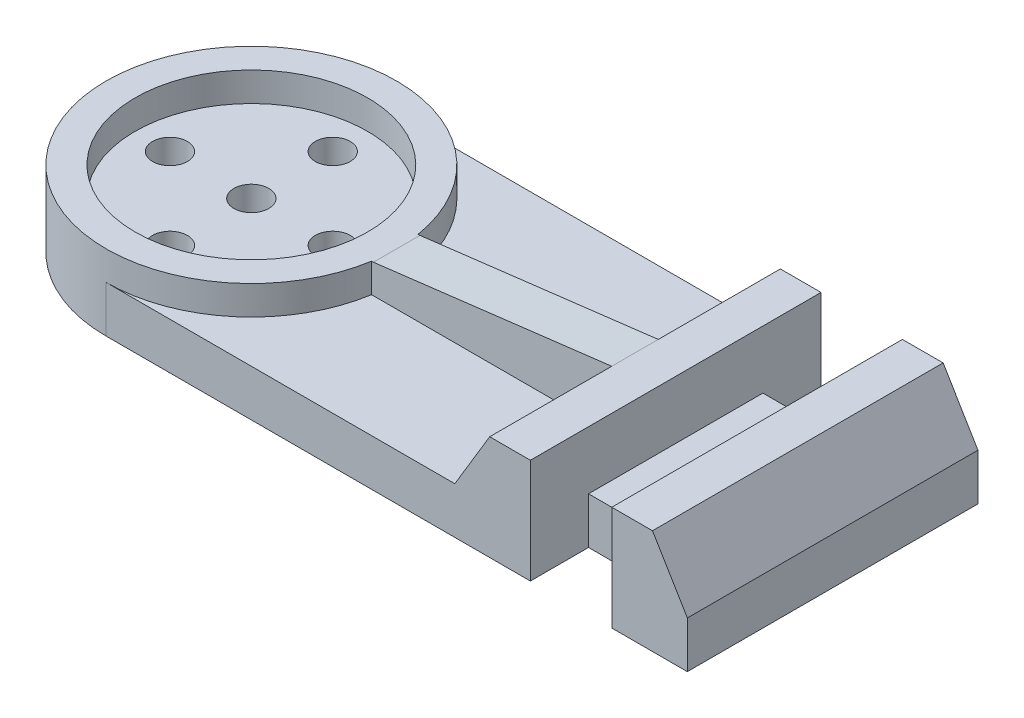
ISO-10303-21;
HEADER;
FILE_DESCRIPTION(('STEP AP214'),'2;1');
FILE_NAME('part.step','',(''),(''),'','','');
FILE_SCHEMA(('AUTOMOTIVE_DESIGN { 1 0 10303 214 1 1 1 1 }'));
ENDSEC;
DATA;
#1=APPLICATION_CONTEXT('core data for automotive mechanical design processes');
#2=APPLICATION_PROTOCOL_DEFINITION('international standard','automotive_design',2000,#1);
#3=PRODUCT_CONTEXT('',#1,'mechanical');
#4=PRODUCT('Part','Part','',(#3));
#5=PRODUCT_RELATED_PRODUCT_CATEGORY('part','',(#4));
#6=PRODUCT_DEFINITION_FORMATION('','',#4);
#7=PRODUCT_DEFINITION_CONTEXT('part definition',#1,'design');
#8=PRODUCT_DEFINITION('design','',#6,#7);
#9=PRODUCT_DEFINITION_SHAPE('','',#8);
#10=(LENGTH_UNIT() NAMED_UNIT(*) SI_UNIT(.MILLI.,.METRE.));
#11=(NAMED_UNIT(*) PLANE_ANGLE_UNIT() SI_UNIT($,.RADIAN.));
#12=(NAMED_UNIT(*) SI_UNIT($,.STERADIAN.) SOLID_ANGLE_UNIT());
#13=UNCERTAINTY_MEASURE_WITH_UNIT(LENGTH_MEASURE(1.E-05),#10,'distance_accuracy_value','');
#14=(GEOMETRIC_REPRESENTATION_CONTEXT(3) GLOBAL_UNCERTAINTY_ASSIGNED_CONTEXT((#13)) GLOBAL_UNIT_ASSIGNED_CONTEXT((#10,
#11,#12)) REPRESENTATION_CONTEXT('',''));
#15=CARTESIAN_POINT('',(0.,0.,0.));
#16=DIRECTION('',(0.,0.,1.));
#17=DIRECTION('',(1.,0.,0.));
#18=AXIS2_PLACEMENT_3D('',#15,#16,#17);
#19=CARTESIAN_POINT('',(0.,4.,0.));
#20=DIRECTION('',(0.,1.,0.));
#21=DIRECTION('',(0.,0.,1.));
#22=AXIS2_PLACEMENT_3D('',#19,#20,#21);
#23=PLANE('',#22);
#24=CARTESIAN_POINT('',(0.,4.,0.));
#25=DIRECTION('',(0.,1.,0.));
#26=DIRECTION('',(0.,0.,1.));
#27=AXIS2_PLACEMENT_3D('',#24,#25,#26);
#28=CIRCLE('',#27,12.5);
#29=CARTESIAN_POINT('',(12.3389626792531,4.,-2.));
#30=VERTEX_POINT('',#29);
#31=CARTESIAN_POINT('',(0.,4.,-12.5));
#32=VERTEX_POINT('',#31);
#33=EDGE_CURVE('E249',#30,#32,#28,.T.);
#34=ORIENTED_EDGE('',*,*,#33,.F.);
#35=DIRECTION('',(1.,0.,0.));
#36=VECTOR('',#35,1.);
#37=CARTESIAN_POINT('',(30.,4.,-2.));
#38=LINE('',#37,#36);
#39=CARTESIAN_POINT('',(30.,4.,-2.));
#40=VERTEX_POINT('',#39);
#41=EDGE_CURVE('E401',#30,#40,#38,.T.);
#42=ORIENTED_EDGE('',*,*,#41,.T.);
#43=DIRECTION('',(0.,0.,1.));
#44=VECTOR('',#43,1.);
#45=CARTESIAN_POINT('',(30.,4.,-33.1155281280883));
#46=LINE('',#45,#44);
#47=CARTESIAN_POINT('',(30.,4.,-12.5));
#48=VERTEX_POINT('',#47);
#49=EDGE_CURVE('E206',#48,#40,#46,.T.);
#50=ORIENTED_EDGE('',*,*,#49,.F.);
#51=DIRECTION('',(1.,0.,0.));
#52=VECTOR('',#51,1.);
#53=CARTESIAN_POINT('',(0.,4.,-12.5));
#54=LINE('',#53,#52);
#55=EDGE_CURVE('E264',#32,#48,#54,.T.);
#56=ORIENTED_EDGE('',*,*,#55,.F.);
#57=EDGE_LOOP('',(#34,#42,#50,#56));
#58=FACE_BOUND('',#57,.T.);
#59=ADVANCED_FACE('F39',(#58),#23,.T.);
#60=CARTESIAN_POINT('',(30.,4.,-33.1155281280883));
#61=DIRECTION('',(-0.857492925712544,0.514495755427526,0.));
#62=DIRECTION('',(-0.514495755427526,-0.857492925712544,0.));
#63=AXIS2_PLACEMENT_3D('',#60,#61,#62);
#64=PLANE('',#63);
#65=ORIENTED_EDGE('',*,*,#49,.T.);
#66=DIRECTION('',(0.514495755427526,0.857492925712544,0.));
#67=VECTOR('',#66,1.);
#68=CARTESIAN_POINT('',(30.,4.,-2.));
#69=LINE('',#68,#67);
#70=CARTESIAN_POINT('',(33.,9.,-2.));
#71=VERTEX_POINT('',#70);
#72=EDGE_CURVE('E404',#40,#71,#69,.T.);
#73=ORIENTED_EDGE('',*,*,#72,.T.);
#74=DIRECTION('',(0.,0.,1.));
#75=VECTOR('',#74,1.);
#76=CARTESIAN_POINT('',(33.,9.,-33.1155281280883));
#77=LINE('',#76,#75);
#78=CARTESIAN_POINT('',(33.,9.,-12.5));
#79=VERTEX_POINT('',#78);
#80=EDGE_CURVE('E212',#79,#71,#77,.T.);
#81=ORIENTED_EDGE('',*,*,#80,.F.);
#82=DIRECTION('',(-0.514495755427526,-0.857492925712544,0.));
#83=VECTOR('',#82,1.);
#84=CARTESIAN_POINT('',(30.,4.,-12.5));
#85=LINE('',#84,#83);
#86=EDGE_CURVE('E207',#79,#48,#85,.T.);
#87=ORIENTED_EDGE('',*,*,#86,.T.);
#88=EDGE_LOOP('',(#65,#73,#81,#87));
#89=FACE_BOUND('',#88,.T.);
#90=ADVANCED_FACE('F331',(#89),#64,.T.);
#91=CARTESIAN_POINT('',(0.,4.,12.5));
#92=DIRECTION('',(0.,0.,-1.));
#93=DIRECTION('',(-1.,0.,0.));
#94=AXIS2_PLACEMENT_3D('',#91,#92,#93);
#95=PLANE('',#94);
#96=DIRECTION('',(1.,0.,0.));
#97=VECTOR('',#96,1.);
#98=CARTESIAN_POINT('',(0.,0.,12.5));
#99=LINE('',#98,#97);
#100=CARTESIAN_POINT('',(0.,0.,12.5));
#101=VERTEX_POINT('',#100);
#102=CARTESIAN_POINT('',(36.5,0.,12.5));
#103=VERTEX_POINT('',#102);
#104=EDGE_CURVE('E271',#101,#103,#99,.T.);
#105=ORIENTED_EDGE('',*,*,#104,.T.);
#106=DIRECTION('',(0.,-1.,0.));
#107=VECTOR('',#106,1.);
#108=CARTESIAN_POINT('',(36.5,9.,12.5));
#109=LINE('',#108,#107);
#110=CARTESIAN_POINT('',(36.5,9.,12.5));
#111=VERTEX_POINT('',#110);
#112=EDGE_CURVE('E416',#111,#103,#109,.T.);
#113=ORIENTED_EDGE('',*,*,#112,.F.);
#114=DIRECTION('',(-1.,0.,0.));
#115=VECTOR('',#114,1.);
#116=CARTESIAN_POINT('',(47.,9.,12.5));
#117=LINE('',#116,#115);
#118=CARTESIAN_POINT('',(33.,9.,12.5));
#119=VERTEX_POINT('',#118);
#120=EDGE_CURVE('E413',#111,#119,#117,.T.);
#121=ORIENTED_EDGE('',*,*,#120,.T.);
#122=DIRECTION('',(-0.514495755427526,-0.857492925712544,0.));
#123=VECTOR('',#122,1.);
#124=CARTESIAN_POINT('',(30.,4.,12.5));
#125=LINE('',#124,#123);
#126=CARTESIAN_POINT('',(30.,4.,12.5));
#127=VERTEX_POINT('',#126);
#128=EDGE_CURVE('E415',#119,#127,#125,.T.);
#129=ORIENTED_EDGE('',*,*,#128,.T.);
#130=DIRECTION('',(1.,0.,0.));
#131=VECTOR('',#130,1.);
#132=CARTESIAN_POINT('',(0.,4.,12.5));
#133=LINE('',#132,#131);
#134=CARTESIAN_POINT('',(0.,4.,12.5));
#135=VERTEX_POINT('',#134);
#136=EDGE_CURVE('E204',#135,#127,#133,.T.);
#137=ORIENTED_EDGE('',*,*,#136,.F.);
#138=DIRECTION('',(0.,-1.,0.));
#139=VECTOR('',#138,1.);
#140=CARTESIAN_POINT('',(0.,4.,12.5));
#141=LINE('',#140,#139);
#142=EDGE_CURVE('E11',#135,#101,#141,.T.);
#143=ORIENTED_EDGE('',*,*,#142,.T.);
#144=EDGE_LOOP('',(#105,#113,#121,#129,#137,#143));
#145=FACE_BOUND('',#144,.T.);
#146=ADVANCED_FACE('F337',(#145),#95,.F.);
#147=CARTESIAN_POINT('',(0.,4.,-12.5));
#148=DIRECTION('',(0.,0.,-1.));
#149=DIRECTION('',(-1.,0.,0.));
#150=AXIS2_PLACEMENT_3D('',#147,#148,#149);
#151=PLANE('',#150);
#152=DIRECTION('',(0.,-1.,0.));
#153=VECTOR('',#152,1.);
#154=CARTESIAN_POINT('',(36.5,9.,-12.5));
#155=LINE('',#154,#153);
#156=CARTESIAN_POINT('',(36.5,9.,-12.5));
#157=VERTEX_POINT('',#156);
#158=CARTESIAN_POINT('',(36.5,0.,-12.5));
#159=VERTEX_POINT('',#158);
#160=EDGE_CURVE('E374',#157,#159,#155,.T.);
#161=ORIENTED_EDGE('',*,*,#160,.T.);
#162=DIRECTION('',(1.,0.,0.));
#163=VECTOR('',#162,1.);
#164=CARTESIAN_POINT('',(0.,0.,-12.5));
#165=LINE('',#164,#163);
#166=CARTESIAN_POINT('',(0.,0.,-12.5));
#167=VERTEX_POINT('',#166);
#168=EDGE_CURVE('E261',#167,#159,#165,.T.);
#169=ORIENTED_EDGE('',*,*,#168,.F.);
#170=DIRECTION('',(0.,-1.,0.));
#171=VECTOR('',#170,1.);
#172=CARTESIAN_POINT('',(0.,4.,-12.5));
#173=LINE('',#172,#171);
#174=EDGE_CURVE('E267',#32,#167,#173,.T.);
#175=ORIENTED_EDGE('',*,*,#174,.F.);
#176=ORIENTED_EDGE('',*,*,#55,.T.);
#177=ORIENTED_EDGE('',*,*,#86,.F.);
#178=DIRECTION('',(-1.,0.,0.));
#179=VECTOR('',#178,1.);
#180=CARTESIAN_POINT('',(47.,9.,-12.5));
#181=LINE('',#180,#179);
#182=EDGE_CURVE('E221',#157,#79,#181,.T.);
#183=ORIENTED_EDGE('',*,*,#182,.F.);
#184=EDGE_LOOP('',(#161,#169,#175,#176,#177,#183));
#185=FACE_BOUND('',#184,.T.);
#186=ADVANCED_FACE('F353',(#185),#151,.T.);
#187=CARTESIAN_POINT('',(47.,9.,-33.1155281280883));
#188=DIRECTION('',(0.,1.,0.));
#189=DIRECTION('',(-1.,0.,0.));
#190=AXIS2_PLACEMENT_3D('',#187,#188,#189);
#191=PLANE('',#190);
#192=DIRECTION('',(0.,0.,1.));
#193=VECTOR('',#192,1.);
#194=CARTESIAN_POINT('',(43.5,9.,-12.5));
#195=LINE('',#194,#193);
#196=CARTESIAN_POINT('',(43.5,9.,-12.5));
#197=VERTEX_POINT('',#196);
#198=CARTESIAN_POINT('',(43.5,9.,12.5));
#199=VERTEX_POINT('',#198);
#200=EDGE_CURVE('E380',#197,#199,#195,.T.);
#201=ORIENTED_EDGE('',*,*,#200,.T.);
#202=CARTESIAN_POINT('',(47.,9.,12.5));
#203=VERTEX_POINT('',#202);
#204=EDGE_CURVE('E417',#203,#199,#117,.T.);
#205=ORIENTED_EDGE('',*,*,#204,.F.);
#206=DIRECTION('',(0.,0.,1.));
#207=VECTOR('',#206,1.);
#208=CARTESIAN_POINT('',(47.,9.,-33.1155281280883));
#209=LINE('',#208,#207);
#210=CARTESIAN_POINT('',(47.,9.,-12.5));
#211=VERTEX_POINT('',#210);
#212=EDGE_CURVE('E219',#211,#203,#209,.T.);
#213=ORIENTED_EDGE('',*,*,#212,.F.);
#214=EDGE_CURVE('E216',#211,#197,#181,.T.);
#215=ORIENTED_EDGE('',*,*,#214,.T.);
#216=EDGE_LOOP('',(#201,#205,#213,#215));
#217=FACE_BOUND('',#216,.T.);
#218=ADVANCED_FACE('F362',(#217),#191,.T.);
#219=CARTESIAN_POINT('',(0.,4.,0.));
#220=DIRECTION('',(0.,-1.,0.));
#221=DIRECTION('',(0.,0.,-1.));
#222=AXIS2_PLACEMENT_3D('',#219,#220,#221);
#223=CYLINDRICAL_SURFACE('',#222,12.5);
#224=CARTESIAN_POINT('',(12.3389626792531,4.,2.));
#225=VERTEX_POINT('',#224);
#226=EDGE_CURVE('E257',#135,#225,#28,.T.);
#227=ORIENTED_EDGE('',*,*,#226,.T.);
#228=DIRECTION('',(0.,-1.,0.));
#229=VECTOR('',#228,1.);
#230=CARTESIAN_POINT('',(12.3389626792531,4.,2.));
#231=LINE('',#230,#229);
#232=CARTESIAN_POINT('',(12.3389626792531,6.5,2.));
#233=VERTEX_POINT('',#232);
#234=EDGE_CURVE('E185',#225,#233,#231,.F.);
#235=ORIENTED_EDGE('',*,*,#234,.T.);
#236=CARTESIAN_POINT('',(0.,6.5,0.));
#237=DIRECTION('',(0.,1.,0.));
#238=DIRECTION('',(0.,0.,1.));
#239=AXIS2_PLACEMENT_3D('',#236,#237,#238);
#240=CIRCLE('',#239,12.5);
#241=CARTESIAN_POINT('',(12.3389626792531,6.5,-2.));
#242=VERTEX_POINT('',#241);
#243=EDGE_CURVE('E253',#242,#233,#240,.T.);
#244=ORIENTED_EDGE('',*,*,#243,.F.);
#245=DIRECTION('',(0.,-1.,0.));
#246=VECTOR('',#245,1.);
#247=CARTESIAN_POINT('',(12.3389626792531,4.,-2.));
#248=LINE('',#247,#246);
#249=EDGE_CURVE('E468',#30,#242,#248,.F.);
#250=ORIENTED_EDGE('',*,*,#249,.F.);
#251=ORIENTED_EDGE('',*,*,#33,.T.);
#252=ORIENTED_EDGE('',*,*,#174,.T.);
#253=CARTESIAN_POINT('',(0.,0.,0.));
#254=DIRECTION('',(0.,1.,0.));
#255=DIRECTION('',(0.,0.,1.));
#256=AXIS2_PLACEMENT_3D('',#253,#254,#255);
#257=CIRCLE('',#256,12.5);
#258=EDGE_CURVE('E256',#167,#101,#257,.T.);
#259=ORIENTED_EDGE('',*,*,#258,.T.);
#260=ORIENTED_EDGE('',*,*,#142,.F.);
#261=EDGE_LOOP('',(#227,#235,#244,#250,#251,#252,#259,#260));
#262=FACE_BOUND('',#261,.T.);
#263=ADVANCED_FACE('F41',(#262),#223,.T.);
#264=DIRECTION('',(0.,1.,0.));
#265=VECTOR('',#264,1.);
#266=CARTESIAN_POINT('',(43.5,9.,12.5));
#267=LINE('',#266,#265);
#268=CARTESIAN_POINT('',(43.5,0.,12.5));
#269=VERTEX_POINT('',#268);
#270=EDGE_CURVE('E443',#269,#199,#267,.T.);
#271=ORIENTED_EDGE('',*,*,#270,.F.);
#272=CARTESIAN_POINT('',(50.,0.,12.5));
#273=VERTEX_POINT('',#272);
#274=EDGE_CURVE('E270',#269,#273,#99,.T.);
#275=ORIENTED_EDGE('',*,*,#274,.T.);
#276=DIRECTION('',(0.,-1.,0.));
#277=VECTOR('',#276,1.);
#278=CARTESIAN_POINT('',(50.,4.,12.5));
#279=LINE('',#278,#277);
#280=CARTESIAN_POINT('',(50.,4.,12.5));
#281=VERTEX_POINT('',#280);
#282=EDGE_CURVE('E48',#281,#273,#279,.T.);
#283=ORIENTED_EDGE('',*,*,#282,.F.);
#284=DIRECTION('',(-0.514495755427527,0.857492925712544,0.));
#285=VECTOR('',#284,1.);
#286=CARTESIAN_POINT('',(50.,4.,12.5));
#287=LINE('',#286,#285);
#288=EDGE_CURVE('E226',#281,#203,#287,.T.);
#289=ORIENTED_EDGE('',*,*,#288,.T.);
#290=ORIENTED_EDGE('',*,*,#204,.T.);
#291=EDGE_LOOP('',(#271,#275,#283,#289,#290));
#292=FACE_BOUND('',#291,.T.);
#293=ADVANCED_FACE('F357',(#292),#95,.F.);
#294=CARTESIAN_POINT('',(50.,4.,0.));
#295=DIRECTION('',(1.,0.,0.));
#296=DIRECTION('',(0.,0.,-1.));
#297=AXIS2_PLACEMENT_3D('',#294,#295,#296);
#298=PLANE('',#297);
#299=DIRECTION('',(0.,0.,1.));
#300=VECTOR('',#299,1.);
#301=CARTESIAN_POINT('',(50.,0.,0.));
#302=LINE('',#301,#300);
#303=CARTESIAN_POINT('',(50.,0.,-12.5));
#304=VERTEX_POINT('',#303);
#305=EDGE_CURVE('E274',#304,#273,#302,.T.);
#306=ORIENTED_EDGE('',*,*,#305,.F.);
#307=DIRECTION('',(0.,-1.,0.));
#308=VECTOR('',#307,1.);
#309=CARTESIAN_POINT('',(50.,4.,-12.5));
#310=LINE('',#309,#308);
#311=CARTESIAN_POINT('',(50.,4.,-12.5));
#312=VERTEX_POINT('',#311);
#313=EDGE_CURVE('E281',#312,#304,#310,.T.);
#314=ORIENTED_EDGE('',*,*,#313,.F.);
#315=DIRECTION('',(0.,0.,1.));
#316=VECTOR('',#315,1.);
#317=CARTESIAN_POINT('',(50.,4.,0.));
#318=LINE('',#317,#316);
#319=EDGE_CURVE('E260',#312,#281,#318,.T.);
#320=ORIENTED_EDGE('',*,*,#319,.T.);
#321=ORIENTED_EDGE('',*,*,#282,.T.);
#322=EDGE_LOOP('',(#306,#314,#320,#321));
#323=FACE_BOUND('',#322,.T.);
#324=ADVANCED_FACE('F350',(#323),#298,.T.);
#325=CARTESIAN_POINT('',(43.5,0.,-12.5));
#326=VERTEX_POINT('',#325);
#327=EDGE_CURVE('E277',#326,#304,#165,.T.);
#328=ORIENTED_EDGE('',*,*,#327,.F.);
#329=DIRECTION('',(0.,1.,0.));
#330=VECTOR('',#329,1.);
#331=CARTESIAN_POINT('',(43.5,9.,-12.5));
#332=LINE('',#331,#330);
#333=EDGE_CURVE('E381',#326,#197,#332,.T.);
#334=ORIENTED_EDGE('',*,*,#333,.T.);
#335=ORIENTED_EDGE('',*,*,#214,.F.);
#336=DIRECTION('',(-0.514495755427527,0.857492925712544,0.));
#337=VECTOR('',#336,1.);
#338=CARTESIAN_POINT('',(50.,4.,-12.5));
#339=LINE('',#338,#337);
#340=EDGE_CURVE('E222',#312,#211,#339,.T.);
#341=ORIENTED_EDGE('',*,*,#340,.F.);
#342=ORIENTED_EDGE('',*,*,#313,.T.);
#343=EDGE_LOOP('',(#328,#334,#335,#341,#342));
#344=FACE_BOUND('',#343,.T.);
#345=ADVANCED_FACE('F343',(#344),#151,.T.);
#346=DIRECTION('',(1.,0.,0.));
#347=VECTOR('',#346,1.);
#348=CARTESIAN_POINT('',(30.,4.,2.));
#349=LINE('',#348,#347);
#350=CARTESIAN_POINT('',(30.,4.,2.));
#351=VERTEX_POINT('',#350);
#352=EDGE_CURVE('E178',#225,#351,#349,.T.);
#353=ORIENTED_EDGE('',*,*,#352,.F.);
#354=ORIENTED_EDGE('',*,*,#226,.F.);
#355=ORIENTED_EDGE('',*,*,#136,.T.);
#356=EDGE_CURVE('E196',#351,#127,#46,.T.);
#357=ORIENTED_EDGE('',*,*,#356,.F.);
#358=EDGE_LOOP('',(#353,#354,#355,#357));
#359=FACE_BOUND('',#358,.T.);
#360=ADVANCED_FACE('F202',(#359),#23,.T.);
#361=CARTESIAN_POINT('',(0.,0.,0.));
#362=DIRECTION('',(0.,1.,0.));
#363=DIRECTION('',(0.,0.,1.));
#364=AXIS2_PLACEMENT_3D('',#361,#362,#363);
#365=PLANE('',#364);
#366=DIRECTION('',(-1.,0.,0.));
#367=VECTOR('',#366,1.);
#368=CARTESIAN_POINT('',(43.5,0.,7.5));
#369=LINE('',#368,#367);
#370=CARTESIAN_POINT('',(43.5,0.,7.5));
#371=VERTEX_POINT('',#370);
#372=CARTESIAN_POINT('',(36.5,0.,7.5));
#373=VERTEX_POINT('',#372);
#374=EDGE_CURVE('E458',#371,#373,#369,.T.);
#375=ORIENTED_EDGE('',*,*,#374,.T.);
#376=DIRECTION('',(0.,0.,1.));
#377=VECTOR('',#376,1.);
#378=CARTESIAN_POINT('',(36.5,0.,7.5));
#379=LINE('',#378,#377);
#380=EDGE_CURVE('E461',#373,#103,#379,.T.);
#381=ORIENTED_EDGE('',*,*,#380,.T.);
#382=ORIENTED_EDGE('',*,*,#104,.F.);
#383=ORIENTED_EDGE('',*,*,#258,.F.);
#384=ORIENTED_EDGE('',*,*,#168,.T.);
#385=DIRECTION('',(0.,0.,1.));
#386=VECTOR('',#385,1.);
#387=CARTESIAN_POINT('',(36.5,0.,-7.5));
#388=LINE('',#387,#386);
#389=CARTESIAN_POINT('',(36.5,0.,-7.5));
#390=VERTEX_POINT('',#389);
#391=EDGE_CURVE('E384',#159,#390,#388,.T.);
#392=ORIENTED_EDGE('',*,*,#391,.T.);
#393=DIRECTION('',(1.,0.,0.));
#394=VECTOR('',#393,1.);
#395=CARTESIAN_POINT('',(43.5,0.,-7.5));
#396=LINE('',#395,#394);
#397=CARTESIAN_POINT('',(43.5,0.,-7.5));
#398=VERTEX_POINT('',#397);
#399=EDGE_CURVE('E390',#390,#398,#396,.T.);
#400=ORIENTED_EDGE('',*,*,#399,.T.);
#401=DIRECTION('',(0.,0.,-1.));
#402=VECTOR('',#401,1.);
#403=CARTESIAN_POINT('',(43.5,0.,-12.5));
#404=LINE('',#403,#402);
#405=EDGE_CURVE('E449',#398,#326,#404,.T.);
#406=ORIENTED_EDGE('',*,*,#405,.T.);
#407=ORIENTED_EDGE('',*,*,#327,.T.);
#408=ORIENTED_EDGE('',*,*,#305,.T.);
#409=ORIENTED_EDGE('',*,*,#274,.F.);
#410=DIRECTION('',(0.,0.,-1.));
#411=VECTOR('',#410,1.);
#412=CARTESIAN_POINT('',(43.5,0.,12.5));
#413=LINE('',#412,#411);
#414=EDGE_CURVE('E463',#269,#371,#413,.T.);
#415=ORIENTED_EDGE('',*,*,#414,.T.);
#416=EDGE_LOOP('',(#375,#381,#382,#383,#384,#392,#400,#406,#407,#408,#409,#415));
#417=FACE_BOUND('',#416,.T.);
#418=CARTESIAN_POINT('',(40.,0.,0.));
#419=DIRECTION('',(0.,-1.,0.));
#420=DIRECTION('',(0.,0.,-1.));
#421=AXIS2_PLACEMENT_3D('',#418,#419,#420);
#422=CIRCLE('',#421,1.5);
#423=CARTESIAN_POINT('',(40.,0.,-1.5));
#424=VERTEX_POINT('',#423);
#425=EDGE_CURVE('E210',#424,#424,#422,.T.);
#426=ORIENTED_EDGE('',*,*,#425,.F.);
#427=EDGE_LOOP('',(#426));
#428=FACE_BOUND('',#427,.T.);
#429=CARTESIAN_POINT('',(0.,0.,7.));
#430=DIRECTION('',(0.,-1.,0.));
#431=DIRECTION('',(0.,0.,-1.));
#432=AXIS2_PLACEMENT_3D('',#429,#430,#431);
#433=CIRCLE('',#432,1.5);
#434=CARTESIAN_POINT('',(0.,0.,5.5));
#435=VERTEX_POINT('',#434);
#436=EDGE_CURVE('E235',#435,#435,#433,.T.);
#437=ORIENTED_EDGE('',*,*,#436,.F.);
#438=EDGE_LOOP('',(#437));
#439=FACE_BOUND('',#438,.T.);
#440=CARTESIAN_POINT('',(7.,0.,0.));
#441=DIRECTION('',(0.,-1.,0.));
#442=DIRECTION('',(0.,0.,-1.));
#443=AXIS2_PLACEMENT_3D('',#440,#441,#442);
#444=CIRCLE('',#443,1.5);
#445=CARTESIAN_POINT('',(7.,0.,-1.50000000000003));
#446=VERTEX_POINT('',#445);
#447=EDGE_CURVE('E231',#446,#446,#444,.T.);
#448=ORIENTED_EDGE('',*,*,#447,.F.);
#449=EDGE_LOOP('',(#448));
#450=FACE_BOUND('',#449,.T.);
#451=CARTESIAN_POINT('',(3.96556555700551E-13,0.,-7.));
#452=DIRECTION('',(0.,-1.,0.));
#453=DIRECTION('',(0.,0.,-1.));
#454=AXIS2_PLACEMENT_3D('',#451,#452,#453);
#455=CIRCLE('',#454,1.50000000000043);
#456=CARTESIAN_POINT('',(3.96556555700551E-13,0.,-8.50000000000043));
#457=VERTEX_POINT('',#456);
#458=EDGE_CURVE('E228',#457,#457,#455,.T.);
#459=ORIENTED_EDGE('',*,*,#458,.F.);
#460=EDGE_LOOP('',(#459));
#461=FACE_BOUND('',#460,.T.);
#462=CARTESIAN_POINT('',(-7.,0.,0.));
#463=DIRECTION('',(0.,-1.,0.));
#464=DIRECTION('',(0.,0.,-1.));
#465=AXIS2_PLACEMENT_3D('',#462,#463,#464);
#466=CIRCLE('',#465,1.5);
#467=CARTESIAN_POINT('',(-7.,0.,-1.49999999999993));
#468=VERTEX_POINT('',#467);
#469=EDGE_CURVE('E232',#468,#468,#466,.T.);
#470=ORIENTED_EDGE('',*,*,#469,.F.);
#471=EDGE_LOOP('',(#470));
#472=FACE_BOUND('',#471,.T.);
#473=CARTESIAN_POINT('',(0.,0.,0.));
#474=DIRECTION('',(0.,-1.,0.));
#475=DIRECTION('',(0.,0.,-1.));
#476=AXIS2_PLACEMENT_3D('',#473,#474,#475);
#477=CIRCLE('',#476,1.5);
#478=CARTESIAN_POINT('',(0.,0.,-1.5));
#479=VERTEX_POINT('',#478);
#480=EDGE_CURVE('E238',#479,#479,#477,.T.);
#481=ORIENTED_EDGE('',*,*,#480,.F.);
#482=EDGE_LOOP('',(#481));
#483=FACE_BOUND('',#482,.T.);
#484=ADVANCED_FACE('F326',(#417,#428,#439,#450,#461,#472,#483),#365,.F.);
#485=CARTESIAN_POINT('',(0.,6.5,0.));
#486=DIRECTION('',(0.,1.,0.));
#487=DIRECTION('',(0.,0.,1.));
#488=AXIS2_PLACEMENT_3D('',#485,#486,#487);
#489=PLANE('',#488);
#490=ORIENTED_EDGE('',*,*,#243,.T.);
#491=DIRECTION('',(-1.,0.,0.));
#492=VECTOR('',#491,1.);
#493=CARTESIAN_POINT('',(10.3514206144576,6.5,2.));
#494=LINE('',#493,#492);
#495=CARTESIAN_POINT('',(12.5,6.5,2.));
#496=VERTEX_POINT('',#495);
#497=EDGE_CURVE('E190',#496,#233,#494,.T.);
#498=ORIENTED_EDGE('',*,*,#497,.F.);
#499=DIRECTION('',(0.,0.,-1.));
#500=VECTOR('',#499,1.);
#501=CARTESIAN_POINT('',(12.5,6.5,2.));
#502=LINE('',#501,#500);
#503=CARTESIAN_POINT('',(12.5,6.5,-2.));
#504=VERTEX_POINT('',#503);
#505=EDGE_CURVE('E471',#496,#504,#502,.T.);
#506=ORIENTED_EDGE('',*,*,#505,.T.);
#507=DIRECTION('',(-1.,0.,0.));
#508=VECTOR('',#507,1.);
#509=CARTESIAN_POINT('',(10.3514206144576,6.5,-2.));
#510=LINE('',#509,#508);
#511=EDGE_CURVE('E476',#504,#242,#510,.T.);
#512=ORIENTED_EDGE('',*,*,#511,.T.);
#513=EDGE_LOOP('',(#490,#498,#506,#512));
#514=FACE_BOUND('',#513,.T.);
#515=CARTESIAN_POINT('',(0.,6.5,0.));
#516=DIRECTION('',(0.,1.,0.));
#517=DIRECTION('',(0.,0.,1.));
#518=AXIS2_PLACEMENT_3D('',#515,#516,#517);
#519=CIRCLE('',#518,10.);
#520=CARTESIAN_POINT('',(0.,6.5,10.));
#521=VERTEX_POINT('',#520);
#522=EDGE_CURVE('E246',#521,#521,#519,.T.);
#523=ORIENTED_EDGE('',*,*,#522,.F.);
#524=EDGE_LOOP('',(#523));
#525=FACE_BOUND('',#524,.T.);
#526=ADVANCED_FACE('F319',(#514,#525),#489,.T.);
#527=CARTESIAN_POINT('',(0.,6.5,0.));
#528=DIRECTION('',(0.,-1.,0.));
#529=DIRECTION('',(0.,0.,-1.));
#530=AXIS2_PLACEMENT_3D('',#527,#528,#529);
#531=CYLINDRICAL_SURFACE('',#530,10.);
#532=ORIENTED_EDGE('',*,*,#522,.T.);
#533=EDGE_LOOP('',(#532));
#534=FACE_BOUND('',#533,.T.);
#535=CARTESIAN_POINT('',(0.,4.,0.));
#536=DIRECTION('',(0.,1.,0.));
#537=DIRECTION('',(0.,0.,1.));
#538=AXIS2_PLACEMENT_3D('',#535,#536,#537);
#539=CIRCLE('',#538,10.);
#540=CARTESIAN_POINT('',(0.,4.,10.));
#541=VERTEX_POINT('',#540);
#542=EDGE_CURVE('E250',#541,#541,#539,.T.);
#543=ORIENTED_EDGE('',*,*,#542,.F.);
#544=EDGE_LOOP('',(#543));
#545=FACE_BOUND('',#544,.T.);
#546=ADVANCED_FACE('F307',(#534,#545),#531,.F.);
#547=CARTESIAN_POINT('',(0.,4.,7.));
#548=DIRECTION('',(0.,1.,0.));
#549=DIRECTION('',(0.,0.,1.));
#550=AXIS2_PLACEMENT_3D('',#547,#548,#549);
#551=CIRCLE('',#550,1.5);
#552=CARTESIAN_POINT('',(0.,4.,8.5));
#553=VERTEX_POINT('',#552);
#554=EDGE_CURVE('E43',#553,#553,#551,.T.);
#555=ORIENTED_EDGE('',*,*,#554,.F.);
#556=EDGE_LOOP('',(#555));
#557=FACE_BOUND('',#556,.T.);
#558=CARTESIAN_POINT('',(7.,4.,0.));
#559=DIRECTION('',(0.,1.,0.));
#560=DIRECTION('',(0.,0.,1.));
#561=AXIS2_PLACEMENT_3D('',#558,#559,#560);
#562=CIRCLE('',#561,1.5);
#563=CARTESIAN_POINT('',(7.,4.,1.49999999999997));
#564=VERTEX_POINT('',#563);
#565=EDGE_CURVE('E293',#564,#564,#562,.T.);
#566=ORIENTED_EDGE('',*,*,#565,.F.);
#567=EDGE_LOOP('',(#566));
#568=FACE_BOUND('',#567,.T.);
#569=CARTESIAN_POINT('',(3.96556555700551E-13,4.,-7.));
#570=DIRECTION('',(0.,1.,0.));
#571=DIRECTION('',(0.,0.,1.));
#572=AXIS2_PLACEMENT_3D('',#569,#570,#571);
#573=CIRCLE('',#572,1.50000000000043);
#574=CARTESIAN_POINT('',(3.96556555700551E-13,4.,-5.49999999999957));
#575=VERTEX_POINT('',#574);
#576=EDGE_CURVE('E291',#575,#575,#573,.T.);
#577=ORIENTED_EDGE('',*,*,#576,.F.);
#578=EDGE_LOOP('',(#577));
#579=FACE_BOUND('',#578,.T.);
#580=CARTESIAN_POINT('',(-7.,4.,0.));
#581=DIRECTION('',(0.,1.,0.));
#582=DIRECTION('',(0.,0.,1.));
#583=AXIS2_PLACEMENT_3D('',#580,#581,#582);
#584=CIRCLE('',#583,1.5);
#585=CARTESIAN_POINT('',(-7.,4.,1.50000000000007));
#586=VERTEX_POINT('',#585);
#587=EDGE_CURVE('E288',#586,#586,#584,.T.);
#588=ORIENTED_EDGE('',*,*,#587,.F.);
#589=EDGE_LOOP('',(#588));
#590=FACE_BOUND('',#589,.T.);
#591=CARTESIAN_POINT('',(0.,4.,0.));
#592=DIRECTION('',(0.,1.,0.));
#593=DIRECTION('',(0.,0.,1.));
#594=AXIS2_PLACEMENT_3D('',#591,#592,#593);
#595=CIRCLE('',#594,1.5);
#596=CARTESIAN_POINT('',(0.,4.,1.5));
#597=VERTEX_POINT('',#596);
#598=EDGE_CURVE('E245',#597,#597,#595,.T.);
#599=ORIENTED_EDGE('',*,*,#598,.F.);
#600=EDGE_LOOP('',(#599));
#601=FACE_BOUND('',#600,.T.);
#602=ORIENTED_EDGE('',*,*,#542,.T.);
#603=EDGE_LOOP('',(#602));
#604=FACE_BOUND('',#603,.T.);
#605=ADVANCED_FACE('F303',(#557,#568,#579,#590,#601,#604),#23,.T.);
#606=CARTESIAN_POINT('',(0.,6.5,0.));
#607=DIRECTION('',(0.,-1.,0.));
#608=DIRECTION('',(0.,0.,-1.));
#609=AXIS2_PLACEMENT_3D('',#606,#607,#608);
#610=CYLINDRICAL_SURFACE('',#609,1.5);
#611=ORIENTED_EDGE('',*,*,#598,.T.);
#612=EDGE_LOOP('',(#611));
#613=FACE_BOUND('',#612,.T.);
#614=ORIENTED_EDGE('',*,*,#480,.T.);
#615=EDGE_LOOP('',(#614));
#616=FACE_BOUND('',#615,.T.);
#617=ADVANCED_FACE('F306',(#613,#616),#610,.F.);
#618=CARTESIAN_POINT('',(-7.,6.5,0.));
#619=DIRECTION('',(0.,-1.,0.));
#620=DIRECTION('',(0.,0.,-1.));
#621=AXIS2_PLACEMENT_3D('',#618,#619,#620);
#622=CYLINDRICAL_SURFACE('',#621,1.5);
#623=ORIENTED_EDGE('',*,*,#587,.T.);
#624=EDGE_LOOP('',(#623));
#625=FACE_BOUND('',#624,.T.);
#626=ORIENTED_EDGE('',*,*,#469,.T.);
#627=EDGE_LOOP('',(#626));
#628=FACE_BOUND('',#627,.T.);
#629=ADVANCED_FACE('F520',(#625,#628),#622,.F.);
#630=CARTESIAN_POINT('',(3.96556555700551E-13,6.5,-7.));
#631=DIRECTION('',(0.,-1.,0.));
#632=DIRECTION('',(0.,0.,-1.));
#633=AXIS2_PLACEMENT_3D('',#630,#631,#632);
#634=CYLINDRICAL_SURFACE('',#633,1.50000000000043);
#635=ORIENTED_EDGE('',*,*,#576,.T.);
#636=EDGE_LOOP('',(#635));
#637=FACE_BOUND('',#636,.T.);
#638=ORIENTED_EDGE('',*,*,#458,.T.);
#639=EDGE_LOOP('',(#638));
#640=FACE_BOUND('',#639,.T.);
#641=ADVANCED_FACE('F516',(#637,#640),#634,.F.);
#642=CARTESIAN_POINT('',(7.,6.5,0.));
#643=DIRECTION('',(0.,-1.,0.));
#644=DIRECTION('',(0.,0.,-1.));
#645=AXIS2_PLACEMENT_3D('',#642,#643,#644);
#646=CYLINDRICAL_SURFACE('',#645,1.5);
#647=ORIENTED_EDGE('',*,*,#565,.T.);
#648=EDGE_LOOP('',(#647));
#649=FACE_BOUND('',#648,.T.);
#650=ORIENTED_EDGE('',*,*,#447,.T.);
#651=EDGE_LOOP('',(#650));
#652=FACE_BOUND('',#651,.T.);
#653=ADVANCED_FACE('F519',(#649,#652),#646,.F.);
#654=CARTESIAN_POINT('',(0.,6.5,7.));
#655=DIRECTION('',(0.,-1.,0.));
#656=DIRECTION('',(0.,0.,-1.));
#657=AXIS2_PLACEMENT_3D('',#654,#655,#656);
#658=CYLINDRICAL_SURFACE('',#657,1.5);
#659=ORIENTED_EDGE('',*,*,#554,.T.);
#660=EDGE_LOOP('',(#659));
#661=FACE_BOUND('',#660,.T.);
#662=ORIENTED_EDGE('',*,*,#436,.T.);
#663=EDGE_LOOP('',(#662));
#664=FACE_BOUND('',#663,.T.);
#665=ADVANCED_FACE('F300',(#661,#664),#658,.F.);
#666=CARTESIAN_POINT('',(40.,6.5,0.));
#667=DIRECTION('',(0.,-1.,0.));
#668=DIRECTION('',(0.,0.,-1.));
#669=AXIS2_PLACEMENT_3D('',#666,#667,#668);
#670=CYLINDRICAL_SURFACE('',#669,1.5);
#671=CARTESIAN_POINT('',(40.,4.,0.));
#672=DIRECTION('',(0.,-1.,0.));
#673=DIRECTION('',(1.,0.,0.));
#674=AXIS2_PLACEMENT_3D('',#671,#672,#673);
#675=CIRCLE('',#674,1.5);
#676=CARTESIAN_POINT('',(41.5,4.,0.));
#677=VERTEX_POINT('',#676);
#678=EDGE_CURVE('E223',#677,#677,#675,.F.);
#679=ORIENTED_EDGE('',*,*,#678,.T.);
#680=EDGE_LOOP('',(#679));
#681=FACE_BOUND('',#680,.T.);
#682=ORIENTED_EDGE('',*,*,#425,.T.);
#683=EDGE_LOOP('',(#682));
#684=FACE_BOUND('',#683,.T.);
#685=ADVANCED_FACE('F515',(#681,#684),#670,.F.);
#686=CARTESIAN_POINT('',(50.,4.,-33.1155281280883));
#687=DIRECTION('',(0.857492925712544,0.514495755427527,0.));
#688=DIRECTION('',(-0.514495755427527,0.857492925712544,0.));
#689=AXIS2_PLACEMENT_3D('',#686,#687,#688);
#690=PLANE('',#689);
#691=ORIENTED_EDGE('',*,*,#319,.F.);
#692=ORIENTED_EDGE('',*,*,#340,.T.);
#693=ORIENTED_EDGE('',*,*,#212,.T.);
#694=ORIENTED_EDGE('',*,*,#288,.F.);
#695=EDGE_LOOP('',(#691,#692,#693,#694));
#696=FACE_BOUND('',#695,.T.);
#697=ADVANCED_FACE('F432',(#696),#690,.T.);
#698=DIRECTION('',(0.,0.,1.));
#699=VECTOR('',#698,1.);
#700=CARTESIAN_POINT('',(36.5,9.,-12.5));
#701=LINE('',#700,#699);
#702=EDGE_CURVE('E408',#157,#111,#701,.T.);
#703=ORIENTED_EDGE('',*,*,#702,.F.);
#704=ORIENTED_EDGE('',*,*,#182,.T.);
#705=ORIENTED_EDGE('',*,*,#80,.T.);
#706=DIRECTION('',(0.,0.,-1.));
#707=VECTOR('',#706,1.);
#708=CARTESIAN_POINT('',(33.,9.,2.));
#709=LINE('',#708,#707);
#710=CARTESIAN_POINT('',(33.,9.,2.));
#711=VERTEX_POINT('',#710);
#712=EDGE_CURVE('E406',#711,#71,#709,.T.);
#713=ORIENTED_EDGE('',*,*,#712,.F.);
#714=EDGE_CURVE('E198',#711,#119,#77,.T.);
#715=ORIENTED_EDGE('',*,*,#714,.T.);
#716=ORIENTED_EDGE('',*,*,#120,.F.);
#717=EDGE_LOOP('',(#703,#704,#705,#713,#715,#716));
#718=FACE_BOUND('',#717,.T.);
#719=ADVANCED_FACE('F370',(#718),#191,.T.);
#720=DIRECTION('',(0.514495755427526,0.857492925712544,0.));
#721=VECTOR('',#720,1.);
#722=CARTESIAN_POINT('',(30.,4.,2.));
#723=LINE('',#722,#721);
#724=EDGE_CURVE('E182',#351,#711,#723,.T.);
#725=ORIENTED_EDGE('',*,*,#724,.F.);
#726=ORIENTED_EDGE('',*,*,#356,.T.);
#727=ORIENTED_EDGE('',*,*,#128,.F.);
#728=ORIENTED_EDGE('',*,*,#714,.F.);
#729=EDGE_LOOP('',(#725,#726,#727,#728));
#730=FACE_BOUND('',#729,.T.);
#731=ADVANCED_FACE('F194',(#730),#64,.T.);
#732=CARTESIAN_POINT('',(43.5,4.,-12.5));
#733=DIRECTION('',(0.,-1.,0.));
#734=DIRECTION('',(1.,0.,0.));
#735=AXIS2_PLACEMENT_3D('',#732,#733,#734);
#736=PLANE('',#735);
#737=DIRECTION('',(0.,0.,1.));
#738=VECTOR('',#737,1.);
#739=CARTESIAN_POINT('',(36.5,4.,-12.5));
#740=LINE('',#739,#738);
#741=CARTESIAN_POINT('',(36.5,4.00000000000002,-7.5));
#742=VERTEX_POINT('',#741);
#743=CARTESIAN_POINT('',(36.5,4.,7.5));
#744=VERTEX_POINT('',#743);
#745=EDGE_CURVE('E436',#742,#744,#740,.T.);
#746=ORIENTED_EDGE('',*,*,#745,.T.);
#747=DIRECTION('',(-1.,0.,0.));
#748=VECTOR('',#747,1.);
#749=CARTESIAN_POINT('',(43.5,4.00000000000003,7.5));
#750=LINE('',#749,#748);
#751=CARTESIAN_POINT('',(43.5,4.00000000000003,7.5));
#752=VERTEX_POINT('',#751);
#753=EDGE_CURVE('E64',#752,#744,#750,.T.);
#754=ORIENTED_EDGE('',*,*,#753,.F.);
#755=DIRECTION('',(0.,0.,1.));
#756=VECTOR('',#755,1.);
#757=CARTESIAN_POINT('',(43.5,4.,-12.5));
#758=LINE('',#757,#756);
#759=CARTESIAN_POINT('',(43.5,4.00000000000003,-7.5));
#760=VERTEX_POINT('',#759);
#761=EDGE_CURVE('E227',#760,#752,#758,.T.);
#762=ORIENTED_EDGE('',*,*,#761,.F.);
#763=DIRECTION('',(1.,0.,0.));
#764=VECTOR('',#763,1.);
#765=CARTESIAN_POINT('',(43.5,4.00000000000003,-7.5));
#766=LINE('',#765,#764);
#767=EDGE_CURVE('E391',#742,#760,#766,.T.);
#768=ORIENTED_EDGE('',*,*,#767,.F.);
#769=EDGE_LOOP('',(#746,#754,#762,#768));
#770=FACE_BOUND('',#769,.T.);
#771=ORIENTED_EDGE('',*,*,#678,.F.);
#772=EDGE_LOOP('',(#771));
#773=FACE_BOUND('',#772,.T.);
#774=ADVANCED_FACE('F502',(#770,#773),#736,.F.);
#775=CARTESIAN_POINT('',(43.5,9.,-12.5));
#776=DIRECTION('',(1.,0.,0.));
#777=DIRECTION('',(0.,0.,-1.));
#778=AXIS2_PLACEMENT_3D('',#775,#776,#777);
#779=PLANE('',#778);
#780=ORIENTED_EDGE('',*,*,#270,.T.);
#781=ORIENTED_EDGE('',*,*,#200,.F.);
#782=ORIENTED_EDGE('',*,*,#333,.F.);
#783=ORIENTED_EDGE('',*,*,#405,.F.);
#784=DIRECTION('',(0.,1.,0.));
#785=VECTOR('',#784,1.);
#786=CARTESIAN_POINT('',(43.5,0.,-7.5));
#787=LINE('',#786,#785);
#788=EDGE_CURVE('E448',#398,#760,#787,.T.);
#789=ORIENTED_EDGE('',*,*,#788,.T.);
#790=ORIENTED_EDGE('',*,*,#761,.T.);
#791=DIRECTION('',(0.,1.,0.));
#792=VECTOR('',#791,1.);
#793=CARTESIAN_POINT('',(43.5,0.,7.5));
#794=LINE('',#793,#792);
#795=EDGE_CURVE('E456',#371,#752,#794,.T.);
#796=ORIENTED_EDGE('',*,*,#795,.F.);
#797=ORIENTED_EDGE('',*,*,#414,.F.);
#798=EDGE_LOOP('',(#780,#781,#782,#783,#789,#790,#796,#797));
#799=FACE_BOUND('',#798,.T.);
#800=ADVANCED_FACE('F505',(#799),#779,.F.);
#801=CARTESIAN_POINT('',(36.5,9.,-12.5));
#802=DIRECTION('',(-1.,0.,0.));
#803=DIRECTION('',(0.,-1.,0.));
#804=AXIS2_PLACEMENT_3D('',#801,#802,#803);
#805=PLANE('',#804);
#806=ORIENTED_EDGE('',*,*,#112,.T.);
#807=ORIENTED_EDGE('',*,*,#380,.F.);
#808=DIRECTION('',(0.,1.,0.));
#809=VECTOR('',#808,1.);
#810=CARTESIAN_POINT('',(36.5,0.,7.5));
#811=LINE('',#810,#809);
#812=EDGE_CURVE('E444',#373,#744,#811,.T.);
#813=ORIENTED_EDGE('',*,*,#812,.T.);
#814=ORIENTED_EDGE('',*,*,#745,.F.);
#815=DIRECTION('',(0.,1.,0.));
#816=VECTOR('',#815,1.);
#817=CARTESIAN_POINT('',(36.5,0.,-7.5));
#818=LINE('',#817,#816);
#819=EDGE_CURVE('E387',#390,#742,#818,.T.);
#820=ORIENTED_EDGE('',*,*,#819,.F.);
#821=ORIENTED_EDGE('',*,*,#391,.F.);
#822=ORIENTED_EDGE('',*,*,#160,.F.);
#823=ORIENTED_EDGE('',*,*,#702,.T.);
#824=EDGE_LOOP('',(#806,#807,#813,#814,#820,#821,#822,#823));
#825=FACE_BOUND('',#824,.T.);
#826=ADVANCED_FACE('F385',(#825),#805,.F.);
#827=CARTESIAN_POINT('',(43.5,0.,-7.5));
#828=DIRECTION('',(0.,0.,1.));
#829=DIRECTION('',(1.,0.,0.));
#830=AXIS2_PLACEMENT_3D('',#827,#828,#829);
#831=PLANE('',#830);
#832=ORIENTED_EDGE('',*,*,#767,.T.);
#833=ORIENTED_EDGE('',*,*,#788,.F.);
#834=ORIENTED_EDGE('',*,*,#399,.F.);
#835=ORIENTED_EDGE('',*,*,#819,.T.);
#836=EDGE_LOOP('',(#832,#833,#834,#835));
#837=FACE_BOUND('',#836,.T.);
#838=ADVANCED_FACE('F498',(#837),#831,.F.);
#839=CARTESIAN_POINT('',(43.5,0.,7.5));
#840=DIRECTION('',(0.,0.,-1.));
#841=DIRECTION('',(-1.,0.,0.));
#842=AXIS2_PLACEMENT_3D('',#839,#840,#841);
#843=PLANE('',#842);
#844=ORIENTED_EDGE('',*,*,#753,.T.);
#845=ORIENTED_EDGE('',*,*,#812,.F.);
#846=ORIENTED_EDGE('',*,*,#374,.F.);
#847=ORIENTED_EDGE('',*,*,#795,.T.);
#848=EDGE_LOOP('',(#844,#845,#846,#847));
#849=FACE_BOUND('',#848,.T.);
#850=ADVANCED_FACE('F493',(#849),#843,.F.);
#851=CARTESIAN_POINT('',(0.,0.,2.));
#852=DIRECTION('',(0.,0.,1.));
#853=DIRECTION('',(1.,0.,0.));
#854=AXIS2_PLACEMENT_3D('',#851,#852,#853);
#855=PLANE('',#854);
#856=ORIENTED_EDGE('',*,*,#234,.F.);
#857=ORIENTED_EDGE('',*,*,#352,.T.);
#858=ORIENTED_EDGE('',*,*,#724,.T.);
#859=DIRECTION('',(-0.992645877550526,-0.12105437531104,0.));
#860=VECTOR('',#859,1.);
#861=CARTESIAN_POINT('',(33.,9.,2.));
#862=LINE('',#861,#860);
#863=EDGE_CURVE('E200',#711,#496,#862,.T.);
#864=ORIENTED_EDGE('',*,*,#863,.T.);
#865=ORIENTED_EDGE('',*,*,#497,.T.);
#866=EDGE_LOOP('',(#856,#857,#858,#864,#865));
#867=FACE_BOUND('',#866,.T.);
#868=ADVANCED_FACE('F180',(#867),#855,.T.);
#869=CARTESIAN_POINT('',(0.,0.,-2.));
#870=DIRECTION('',(0.,0.,1.));
#871=DIRECTION('',(1.,0.,0.));
#872=AXIS2_PLACEMENT_3D('',#869,#870,#871);
#873=PLANE('',#872);
#874=ORIENTED_EDGE('',*,*,#41,.F.);
#875=ORIENTED_EDGE('',*,*,#249,.T.);
#876=ORIENTED_EDGE('',*,*,#511,.F.);
#877=DIRECTION('',(-0.992645877550526,-0.12105437531104,0.));
#878=VECTOR('',#877,1.);
#879=CARTESIAN_POINT('',(33.,9.,-2.));
#880=LINE('',#879,#878);
#881=EDGE_CURVE('E56',#71,#504,#880,.T.);
#882=ORIENTED_EDGE('',*,*,#881,.F.);
#883=ORIENTED_EDGE('',*,*,#72,.F.);
#884=EDGE_LOOP('',(#874,#875,#876,#882,#883));
#885=FACE_BOUND('',#884,.T.);
#886=ADVANCED_FACE('F483',(#885),#873,.F.);
#887=CARTESIAN_POINT('',(33.,9.,2.));
#888=DIRECTION('',(0.12105437531104,-0.992645877550526,0.));
#889=DIRECTION('',(0.992645877550526,0.12105437531104,0.));
#890=AXIS2_PLACEMENT_3D('',#887,#888,#889);
#891=PLANE('',#890);
#892=ORIENTED_EDGE('',*,*,#881,.T.);
#893=ORIENTED_EDGE('',*,*,#505,.F.);
#894=ORIENTED_EDGE('',*,*,#863,.F.);
#895=ORIENTED_EDGE('',*,*,#712,.T.);
#896=EDGE_LOOP('',(#892,#893,#894,#895));
#897=FACE_BOUND('',#896,.T.);
#898=ADVANCED_FACE('F485',(#897),#891,.F.);
#899=CLOSED_SHELL('',(#59,#90,#146,#186,#218,#263,#293,#324,#345,#360,#484,#526,#546,#605,#617,
#629,#641,#653,#665,#685,#697,#719,#731,#774,#800,#826,#838,#850,#868,#886,#898));
#900=MANIFOLD_SOLID_BREP('B2',#899);
#901=ADVANCED_BREP_SHAPE_REPRESENTATION('',(#18,#900),#14);
#902=SHAPE_DEFINITION_REPRESENTATION(#9,#901);
ENDSEC;
END-ISO-10303-21;
